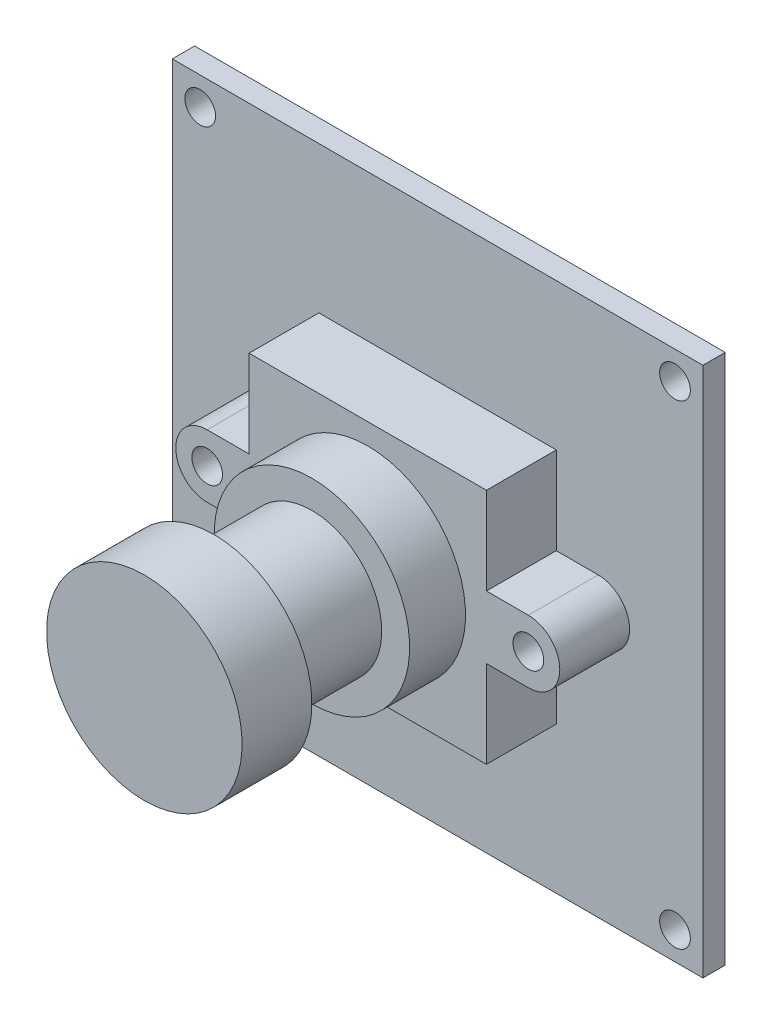
ISO-10303-21;
HEADER;
FILE_DESCRIPTION(('STEP AP214'),'2;1');
FILE_NAME('part.step','',(''),(''),'','','');
FILE_SCHEMA(('AUTOMOTIVE_DESIGN { 1 0 10303 214 1 1 1 1 }'));
ENDSEC;
DATA;
#1=APPLICATION_CONTEXT('core data for automotive mechanical design processes');
#2=APPLICATION_PROTOCOL_DEFINITION('international standard','automotive_design',2000,#1);
#3=PRODUCT_CONTEXT('',#1,'mechanical');
#4=PRODUCT('Part','Part','',(#3));
#5=PRODUCT_RELATED_PRODUCT_CATEGORY('part','',(#4));
#6=PRODUCT_DEFINITION_FORMATION('','',#4);
#7=PRODUCT_DEFINITION_CONTEXT('part definition',#1,'design');
#8=PRODUCT_DEFINITION('design','',#6,#7);
#9=PRODUCT_DEFINITION_SHAPE('','',#8);
#10=(LENGTH_UNIT() NAMED_UNIT(*) SI_UNIT(.MILLI.,.METRE.));
#11=(NAMED_UNIT(*) PLANE_ANGLE_UNIT() SI_UNIT($,.RADIAN.));
#12=(NAMED_UNIT(*) SI_UNIT($,.STERADIAN.) SOLID_ANGLE_UNIT());
#13=UNCERTAINTY_MEASURE_WITH_UNIT(LENGTH_MEASURE(1.E-05),#10,'distance_accuracy_value','');
#14=(GEOMETRIC_REPRESENTATION_CONTEXT(3) GLOBAL_UNCERTAINTY_ASSIGNED_CONTEXT((#13)) GLOBAL_UNIT_ASSIGNED_CONTEXT((#10,
#11,#12)) REPRESENTATION_CONTEXT('',''));
#15=CARTESIAN_POINT('',(0.,0.,0.));
#16=DIRECTION('',(0.,0.,1.));
#17=DIRECTION('',(1.,0.,0.));
#18=AXIS2_PLACEMENT_3D('',#15,#16,#17);
#19=CARTESIAN_POINT('',(0.,0.,0.));
#20=DIRECTION('',(0.,0.,-1.));
#21=DIRECTION('',(-1.,0.,0.));
#22=AXIS2_PLACEMENT_3D('',#19,#20,#21);
#23=PLANE('',#22);
#24=DIRECTION('',(0.,1.,0.));
#25=VECTOR('',#24,1.);
#26=CARTESIAN_POINT('',(-19.,-19.,0.));
#27=LINE('',#26,#25);
#28=CARTESIAN_POINT('',(-19.,-19.,0.));
#29=VERTEX_POINT('',#28);
#30=CARTESIAN_POINT('',(-19.,19.,0.));
#31=VERTEX_POINT('',#30);
#32=EDGE_CURVE('E518',#29,#31,#27,.T.);
#33=ORIENTED_EDGE('',*,*,#32,.F.);
#34=DIRECTION('',(1.,0.,0.));
#35=VECTOR('',#34,1.);
#36=CARTESIAN_POINT('',(-19.,-19.,0.));
#37=LINE('',#36,#35);
#38=CARTESIAN_POINT('',(19.,-19.,0.));
#39=VERTEX_POINT('',#38);
#40=EDGE_CURVE('E525',#29,#39,#37,.T.);
#41=ORIENTED_EDGE('',*,*,#40,.T.);
#42=DIRECTION('',(0.,1.,0.));
#43=VECTOR('',#42,1.);
#44=CARTESIAN_POINT('',(19.,-19.,0.));
#45=LINE('',#44,#43);
#46=CARTESIAN_POINT('',(19.,19.,0.));
#47=VERTEX_POINT('',#46);
#48=EDGE_CURVE('E539',#39,#47,#45,.T.);
#49=ORIENTED_EDGE('',*,*,#48,.T.);
#50=DIRECTION('',(1.,0.,0.));
#51=VECTOR('',#50,1.);
#52=CARTESIAN_POINT('',(-19.,19.,0.));
#53=LINE('',#52,#51);
#54=EDGE_CURVE('E536',#31,#47,#53,.T.);
#55=ORIENTED_EDGE('',*,*,#54,.F.);
#56=EDGE_LOOP('',(#33,#41,#49,#55));
#57=FACE_BOUND('',#56,.T.);
#58=CARTESIAN_POINT('',(-17.,17.,0.));
#59=DIRECTION('',(0.,0.,1.));
#60=DIRECTION('',(1.,0.,0.));
#61=AXIS2_PLACEMENT_3D('',#58,#59,#60);
#62=CIRCLE('',#61,1.1);
#63=CARTESIAN_POINT('',(-15.9,17.,0.));
#64=VERTEX_POINT('',#63);
#65=EDGE_CURVE('E512',#64,#64,#62,.T.);
#66=ORIENTED_EDGE('',*,*,#65,.F.);
#67=EDGE_LOOP('',(#66));
#68=FACE_BOUND('',#67,.T.);
#69=CARTESIAN_POINT('',(17.,17.,0.));
#70=DIRECTION('',(0.,0.,1.));
#71=DIRECTION('',(1.,0.,0.));
#72=AXIS2_PLACEMENT_3D('',#69,#70,#71);
#73=CIRCLE('',#72,1.1);
#74=CARTESIAN_POINT('',(18.1,17.,0.));
#75=VERTEX_POINT('',#74);
#76=EDGE_CURVE('E506',#75,#75,#73,.T.);
#77=ORIENTED_EDGE('',*,*,#76,.F.);
#78=EDGE_LOOP('',(#77));
#79=FACE_BOUND('',#78,.T.);
#80=CARTESIAN_POINT('',(17.0000000000004,-17.,0.));
#81=DIRECTION('',(0.,0.,1.));
#82=DIRECTION('',(1.,0.,0.));
#83=AXIS2_PLACEMENT_3D('',#80,#81,#82);
#84=CIRCLE('',#83,1.1);
#85=CARTESIAN_POINT('',(18.1000000000004,-17.,0.));
#86=VERTEX_POINT('',#85);
#87=EDGE_CURVE('E500',#86,#86,#84,.T.);
#88=ORIENTED_EDGE('',*,*,#87,.F.);
#89=EDGE_LOOP('',(#88));
#90=FACE_BOUND('',#89,.T.);
#91=CARTESIAN_POINT('',(-16.9999999999996,-17.,0.));
#92=DIRECTION('',(0.,0.,1.));
#93=DIRECTION('',(1.,0.,0.));
#94=AXIS2_PLACEMENT_3D('',#91,#92,#93);
#95=CIRCLE('',#94,1.1);
#96=CARTESIAN_POINT('',(-15.8999999999996,-17.,0.));
#97=VERTEX_POINT('',#96);
#98=EDGE_CURVE('E496',#97,#97,#95,.T.);
#99=ORIENTED_EDGE('',*,*,#98,.F.);
#100=EDGE_LOOP('',(#99));
#101=FACE_BOUND('',#100,.T.);
#102=CARTESIAN_POINT('',(11.5,0.,0.));
#103=DIRECTION('',(0.,0.,1.));
#104=DIRECTION('',(1.,0.,0.));
#105=AXIS2_PLACEMENT_3D('',#102,#103,#104);
#106=CIRCLE('',#105,2.25);
#107=CARTESIAN_POINT('',(11.5,-2.24999999999999,0.));
#108=VERTEX_POINT('',#107);
#109=CARTESIAN_POINT('',(11.5,2.25000000000001,0.));
#110=VERTEX_POINT('',#109);
#111=EDGE_CURVE('E469',#108,#110,#106,.T.);
#112=ORIENTED_EDGE('',*,*,#111,.F.);
#113=DIRECTION('',(1.,0.,0.));
#114=VECTOR('',#113,1.);
#115=CARTESIAN_POINT('',(-11.5,-2.25,0.));
#116=LINE('',#115,#114);
#117=CARTESIAN_POINT('',(8.5,-2.25,0.));
#118=VERTEX_POINT('',#117);
#119=EDGE_CURVE('E465',#118,#108,#116,.T.);
#120=ORIENTED_EDGE('',*,*,#119,.F.);
#121=DIRECTION('',(0.,1.,0.));
#122=VECTOR('',#121,1.);
#123=CARTESIAN_POINT('',(8.5,-8.5,0.));
#124=LINE('',#123,#122);
#125=CARTESIAN_POINT('',(8.5,-8.5,0.));
#126=VERTEX_POINT('',#125);
#127=EDGE_CURVE('E417',#126,#118,#124,.T.);
#128=ORIENTED_EDGE('',*,*,#127,.F.);
#129=DIRECTION('',(1.,0.,0.));
#130=VECTOR('',#129,1.);
#131=CARTESIAN_POINT('',(-8.50000000000001,-8.5,0.));
#132=LINE('',#131,#130);
#133=CARTESIAN_POINT('',(-8.50000000000001,-8.5,0.));
#134=VERTEX_POINT('',#133);
#135=EDGE_CURVE('E420',#134,#126,#132,.T.);
#136=ORIENTED_EDGE('',*,*,#135,.F.);
#137=DIRECTION('',(0.,1.,0.));
#138=VECTOR('',#137,1.);
#139=CARTESIAN_POINT('',(-8.50000000000001,-8.5,0.));
#140=LINE('',#139,#138);
#141=CARTESIAN_POINT('',(-8.50000000000001,-2.25,0.));
#142=VERTEX_POINT('',#141);
#143=EDGE_CURVE('E411',#134,#142,#140,.T.);
#144=ORIENTED_EDGE('',*,*,#143,.T.);
#145=CARTESIAN_POINT('',(-11.5,-2.25,0.));
#146=VERTEX_POINT('',#145);
#147=EDGE_CURVE('E466',#146,#142,#116,.T.);
#148=ORIENTED_EDGE('',*,*,#147,.F.);
#149=CARTESIAN_POINT('',(-11.5,0.,0.));
#150=DIRECTION('',(0.,0.,1.));
#151=DIRECTION('',(1.,0.,0.));
#152=AXIS2_PLACEMENT_3D('',#149,#150,#151);
#153=CIRCLE('',#152,2.25);
#154=CARTESIAN_POINT('',(-11.5,2.25,0.));
#155=VERTEX_POINT('',#154);
#156=EDGE_CURVE('E444',#155,#146,#153,.T.);
#157=ORIENTED_EDGE('',*,*,#156,.F.);
#158=DIRECTION('',(1.,0.,0.));
#159=VECTOR('',#158,1.);
#160=CARTESIAN_POINT('',(-11.5,2.25,0.));
#161=LINE('',#160,#159);
#162=CARTESIAN_POINT('',(-8.50000000000001,2.25,0.));
#163=VERTEX_POINT('',#162);
#164=EDGE_CURVE('E451',#155,#163,#161,.T.);
#165=ORIENTED_EDGE('',*,*,#164,.T.);
#166=CARTESIAN_POINT('',(-8.50000000000001,8.5,0.));
#167=VERTEX_POINT('',#166);
#168=EDGE_CURVE('E414',#163,#167,#140,.T.);
#169=ORIENTED_EDGE('',*,*,#168,.T.);
#170=DIRECTION('',(1.,0.,0.));
#171=VECTOR('',#170,1.);
#172=CARTESIAN_POINT('',(-8.50000000000001,8.5,0.));
#173=LINE('',#172,#171);
#174=CARTESIAN_POINT('',(8.5,8.5,0.));
#175=VERTEX_POINT('',#174);
#176=EDGE_CURVE('E413',#167,#175,#173,.T.);
#177=ORIENTED_EDGE('',*,*,#176,.T.);
#178=CARTESIAN_POINT('',(8.5,2.25000000000001,0.));
#179=VERTEX_POINT('',#178);
#180=EDGE_CURVE('E416',#179,#175,#124,.T.);
#181=ORIENTED_EDGE('',*,*,#180,.F.);
#182=EDGE_CURVE('E472',#179,#110,#161,.T.);
#183=ORIENTED_EDGE('',*,*,#182,.T.);
#184=EDGE_LOOP('',(#112,#120,#128,#136,#144,#148,#157,#165,#169,#177,#181,#183));
#185=FACE_BOUND('',#184,.T.);
#186=ADVANCED_FACE('F163',(#57,#68,#79,#90,#101,#185),#23,.F.);
#187=CARTESIAN_POINT('',(-19.,-19.,-1.6));
#188=DIRECTION('',(1.,0.,0.));
#189=DIRECTION('',(0.,0.,-1.));
#190=AXIS2_PLACEMENT_3D('',#187,#188,#189);
#191=PLANE('',#190);
#192=ORIENTED_EDGE('',*,*,#32,.T.);
#193=DIRECTION('',(0.,0.,1.));
#194=VECTOR('',#193,1.);
#195=CARTESIAN_POINT('',(-19.,19.,-1.6));
#196=LINE('',#195,#194);
#197=CARTESIAN_POINT('',(-19.,19.,-1.6));
#198=VERTEX_POINT('',#197);
#199=EDGE_CURVE('E549',#198,#31,#196,.T.);
#200=ORIENTED_EDGE('',*,*,#199,.F.);
#201=DIRECTION('',(0.,1.,0.));
#202=VECTOR('',#201,1.);
#203=CARTESIAN_POINT('',(-19.,-19.,-1.6));
#204=LINE('',#203,#202);
#205=CARTESIAN_POINT('',(-19.,-19.,-1.6));
#206=VERTEX_POINT('',#205);
#207=EDGE_CURVE('E521',#206,#198,#204,.T.);
#208=ORIENTED_EDGE('',*,*,#207,.F.);
#209=DIRECTION('',(0.,0.,1.));
#210=VECTOR('',#209,1.);
#211=CARTESIAN_POINT('',(-19.,-19.,-1.6));
#212=LINE('',#211,#210);
#213=EDGE_CURVE('E533',#206,#29,#212,.T.);
#214=ORIENTED_EDGE('',*,*,#213,.T.);
#215=EDGE_LOOP('',(#192,#200,#208,#214));
#216=FACE_BOUND('',#215,.T.);
#217=ADVANCED_FACE('F165',(#216),#191,.F.);
#218=CARTESIAN_POINT('',(-19.,19.,-1.6));
#219=DIRECTION('',(0.,-1.,0.));
#220=DIRECTION('',(0.,0.,-1.));
#221=AXIS2_PLACEMENT_3D('',#218,#219,#220);
#222=PLANE('',#221);
#223=ORIENTED_EDGE('',*,*,#54,.T.);
#224=DIRECTION('',(0.,0.,1.));
#225=VECTOR('',#224,1.);
#226=CARTESIAN_POINT('',(19.,19.,-1.6));
#227=LINE('',#226,#225);
#228=CARTESIAN_POINT('',(19.,19.,-1.6));
#229=VERTEX_POINT('',#228);
#230=EDGE_CURVE('E547',#229,#47,#227,.T.);
#231=ORIENTED_EDGE('',*,*,#230,.F.);
#232=DIRECTION('',(1.,0.,0.));
#233=VECTOR('',#232,1.);
#234=CARTESIAN_POINT('',(-19.,19.,-1.6));
#235=LINE('',#234,#233);
#236=EDGE_CURVE('E524',#198,#229,#235,.T.);
#237=ORIENTED_EDGE('',*,*,#236,.F.);
#238=ORIENTED_EDGE('',*,*,#199,.T.);
#239=EDGE_LOOP('',(#223,#231,#237,#238));
#240=FACE_BOUND('',#239,.T.);
#241=ADVANCED_FACE('F585',(#240),#222,.F.);
#242=CARTESIAN_POINT('',(19.,-19.,-1.6));
#243=DIRECTION('',(1.,0.,0.));
#244=DIRECTION('',(0.,0.,-1.));
#245=AXIS2_PLACEMENT_3D('',#242,#243,#244);
#246=PLANE('',#245);
#247=ORIENTED_EDGE('',*,*,#48,.F.);
#248=DIRECTION('',(0.,0.,1.));
#249=VECTOR('',#248,1.);
#250=CARTESIAN_POINT('',(19.,-19.,-1.6));
#251=LINE('',#250,#249);
#252=CARTESIAN_POINT('',(19.,-19.,-1.6));
#253=VERTEX_POINT('',#252);
#254=EDGE_CURVE('E545',#253,#39,#251,.T.);
#255=ORIENTED_EDGE('',*,*,#254,.F.);
#256=DIRECTION('',(0.,1.,0.));
#257=VECTOR('',#256,1.);
#258=CARTESIAN_POINT('',(19.,-19.,-1.6));
#259=LINE('',#258,#257);
#260=EDGE_CURVE('E527',#253,#229,#259,.T.);
#261=ORIENTED_EDGE('',*,*,#260,.T.);
#262=ORIENTED_EDGE('',*,*,#230,.T.);
#263=EDGE_LOOP('',(#247,#255,#261,#262));
#264=FACE_BOUND('',#263,.T.);
#265=ADVANCED_FACE('F661',(#264),#246,.T.);
#266=CARTESIAN_POINT('',(-19.,-19.,-1.6));
#267=DIRECTION('',(0.,-1.,0.));
#268=DIRECTION('',(0.,0.,-1.));
#269=AXIS2_PLACEMENT_3D('',#266,#267,#268);
#270=PLANE('',#269);
#271=ORIENTED_EDGE('',*,*,#40,.F.);
#272=ORIENTED_EDGE('',*,*,#213,.F.);
#273=DIRECTION('',(1.,0.,0.));
#274=VECTOR('',#273,1.);
#275=CARTESIAN_POINT('',(-19.,-19.,-1.6));
#276=LINE('',#275,#274);
#277=EDGE_CURVE('E530',#206,#253,#276,.T.);
#278=ORIENTED_EDGE('',*,*,#277,.T.);
#279=ORIENTED_EDGE('',*,*,#254,.T.);
#280=EDGE_LOOP('',(#271,#272,#278,#279));
#281=FACE_BOUND('',#280,.T.);
#282=ADVANCED_FACE('F656',(#281),#270,.T.);
#283=CARTESIAN_POINT('',(0.,0.,-1.6));
#284=DIRECTION('',(0.,0.,-1.));
#285=DIRECTION('',(-1.,0.,0.));
#286=AXIS2_PLACEMENT_3D('',#283,#284,#285);
#287=PLANE('',#286);
#288=DIRECTION('',(-1.,0.,0.));
#289=VECTOR('',#288,1.);
#290=CARTESIAN_POINT('',(0.,-16.7999999999893,-1.6));
#291=LINE('',#290,#289);
#292=CARTESIAN_POINT('',(12.0000000000005,-16.7999999999893,-1.6));
#293=VERTEX_POINT('',#292);
#294=CARTESIAN_POINT('',(5.99999999997181,-16.7999999999893,-1.6));
#295=VERTEX_POINT('',#294);
#296=EDGE_CURVE('E12',#293,#295,#291,.T.);
#297=ORIENTED_EDGE('',*,*,#296,.F.);
#298=DIRECTION('',(0.,-1.,0.));
#299=VECTOR('',#298,1.);
#300=CARTESIAN_POINT('',(12.0000000000005,0.,-1.6));
#301=LINE('',#300,#299);
#302=CARTESIAN_POINT('',(12.0000000000005,-13.8000000000053,-1.6));
#303=VERTEX_POINT('',#302);
#304=EDGE_CURVE('E326',#303,#293,#301,.T.);
#305=ORIENTED_EDGE('',*,*,#304,.F.);
#306=DIRECTION('',(1.,0.,0.));
#307=VECTOR('',#306,1.);
#308=CARTESIAN_POINT('',(0.,-13.8000000000053,-1.6));
#309=LINE('',#308,#307);
#310=CARTESIAN_POINT('',(5.99999999997181,-13.8000000000053,-1.6));
#311=VERTEX_POINT('',#310);
#312=EDGE_CURVE('E181',#311,#303,#309,.T.);
#313=ORIENTED_EDGE('',*,*,#312,.F.);
#314=DIRECTION('',(0.,1.,0.));
#315=VECTOR('',#314,1.);
#316=CARTESIAN_POINT('',(5.99999999997181,0.,-1.6));
#317=LINE('',#316,#315);
#318=EDGE_CURVE('E171',#295,#311,#317,.T.);
#319=ORIENTED_EDGE('',*,*,#318,.F.);
#320=EDGE_LOOP('',(#297,#305,#313,#319));
#321=FACE_BOUND('',#320,.T.);
#322=DIRECTION('',(-1.,0.,0.));
#323=VECTOR('',#322,1.);
#324=CARTESIAN_POINT('',(0.,-16.8000000000056,-1.6));
#325=LINE('',#324,#323);
#326=CARTESIAN_POINT('',(2.50000000002518,-16.7999999999893,-1.6));
#327=VERTEX_POINT('',#326);
#328=CARTESIAN_POINT('',(-6.50000000001876,-16.7999999999893,-1.6));
#329=VERTEX_POINT('',#328);
#330=EDGE_CURVE('E561',#327,#329,#325,.T.);
#331=ORIENTED_EDGE('',*,*,#330,.F.);
#332=DIRECTION('',(0.,-1.,0.));
#333=VECTOR('',#332,1.);
#334=CARTESIAN_POINT('',(2.50000000002518,0.,-1.6));
#335=LINE('',#334,#333);
#336=CARTESIAN_POINT('',(2.50000000002518,-13.8000000000275,-1.6));
#337=VERTEX_POINT('',#336);
#338=EDGE_CURVE('E552',#337,#327,#335,.T.);
#339=ORIENTED_EDGE('',*,*,#338,.F.);
#340=DIRECTION('',(1.,0.,0.));
#341=VECTOR('',#340,1.);
#342=CARTESIAN_POINT('',(0.,-13.8000000000275,-1.6));
#343=LINE('',#342,#341);
#344=CARTESIAN_POINT('',(-6.50000000001876,-13.8000000000275,-1.6));
#345=VERTEX_POINT('',#344);
#346=EDGE_CURVE('E555',#345,#337,#343,.T.);
#347=ORIENTED_EDGE('',*,*,#346,.F.);
#348=DIRECTION('',(0.,1.,0.));
#349=VECTOR('',#348,1.);
#350=CARTESIAN_POINT('',(-6.50000000001875,0.,-1.6));
#351=LINE('',#350,#349);
#352=EDGE_CURVE('E558',#329,#345,#351,.T.);
#353=ORIENTED_EDGE('',*,*,#352,.F.);
#354=EDGE_LOOP('',(#331,#339,#347,#353));
#355=FACE_BOUND('',#354,.T.);
#356=CARTESIAN_POINT('',(-16.9999999999996,-17.,-1.6));
#357=DIRECTION('',(0.,0.,1.));
#358=DIRECTION('',(1.,0.,0.));
#359=AXIS2_PLACEMENT_3D('',#356,#357,#358);
#360=CIRCLE('',#359,1.1);
#361=CARTESIAN_POINT('',(-15.8999999999996,-17.,-1.6));
#362=VERTEX_POINT('',#361);
#363=EDGE_CURVE('E497',#362,#362,#360,.T.);
#364=ORIENTED_EDGE('',*,*,#363,.T.);
#365=EDGE_LOOP('',(#364));
#366=FACE_BOUND('',#365,.T.);
#367=CARTESIAN_POINT('',(17.0000000000004,-17.,-1.6));
#368=DIRECTION('',(0.,0.,1.));
#369=DIRECTION('',(1.,0.,0.));
#370=AXIS2_PLACEMENT_3D('',#367,#368,#369);
#371=CIRCLE('',#370,1.1);
#372=CARTESIAN_POINT('',(18.1000000000004,-17.,-1.6));
#373=VERTEX_POINT('',#372);
#374=EDGE_CURVE('E503',#373,#373,#371,.T.);
#375=ORIENTED_EDGE('',*,*,#374,.T.);
#376=EDGE_LOOP('',(#375));
#377=FACE_BOUND('',#376,.T.);
#378=CARTESIAN_POINT('',(17.,17.,-1.6));
#379=DIRECTION('',(0.,0.,1.));
#380=DIRECTION('',(1.,0.,0.));
#381=AXIS2_PLACEMENT_3D('',#378,#379,#380);
#382=CIRCLE('',#381,1.1);
#383=CARTESIAN_POINT('',(18.1,17.,-1.6));
#384=VERTEX_POINT('',#383);
#385=EDGE_CURVE('E509',#384,#384,#382,.T.);
#386=ORIENTED_EDGE('',*,*,#385,.T.);
#387=EDGE_LOOP('',(#386));
#388=FACE_BOUND('',#387,.T.);
#389=CARTESIAN_POINT('',(-17.,17.,-1.6));
#390=DIRECTION('',(0.,0.,1.));
#391=DIRECTION('',(1.,0.,0.));
#392=AXIS2_PLACEMENT_3D('',#389,#390,#391);
#393=CIRCLE('',#392,1.1);
#394=CARTESIAN_POINT('',(-15.9,17.,-1.6));
#395=VERTEX_POINT('',#394);
#396=EDGE_CURVE('E515',#395,#395,#393,.T.);
#397=ORIENTED_EDGE('',*,*,#396,.T.);
#398=EDGE_LOOP('',(#397));
#399=FACE_BOUND('',#398,.T.);
#400=ORIENTED_EDGE('',*,*,#207,.T.);
#401=ORIENTED_EDGE('',*,*,#236,.T.);
#402=ORIENTED_EDGE('',*,*,#260,.F.);
#403=ORIENTED_EDGE('',*,*,#277,.F.);
#404=EDGE_LOOP('',(#400,#401,#402,#403));
#405=FACE_BOUND('',#404,.T.);
#406=ADVANCED_FACE('F653',(#321,#355,#366,#377,#388,#399,#405),#287,.T.);
#407=CARTESIAN_POINT('',(-17.,17.,-1.6));
#408=DIRECTION('',(0.,0.,1.));
#409=DIRECTION('',(1.,0.,0.));
#410=AXIS2_PLACEMENT_3D('',#407,#408,#409);
#411=CYLINDRICAL_SURFACE('',#410,1.1);
#412=ORIENTED_EDGE('',*,*,#396,.F.);
#413=EDGE_LOOP('',(#412));
#414=FACE_BOUND('',#413,.T.);
#415=ORIENTED_EDGE('',*,*,#65,.T.);
#416=EDGE_LOOP('',(#415));
#417=FACE_BOUND('',#416,.T.);
#418=ADVANCED_FACE('F650',(#414,#417),#411,.F.);
#419=CARTESIAN_POINT('',(17.,17.,-1.6));
#420=DIRECTION('',(0.,0.,1.));
#421=DIRECTION('',(1.,0.,0.));
#422=AXIS2_PLACEMENT_3D('',#419,#420,#421);
#423=CYLINDRICAL_SURFACE('',#422,1.1);
#424=ORIENTED_EDGE('',*,*,#385,.F.);
#425=EDGE_LOOP('',(#424));
#426=FACE_BOUND('',#425,.T.);
#427=ORIENTED_EDGE('',*,*,#76,.T.);
#428=EDGE_LOOP('',(#427));
#429=FACE_BOUND('',#428,.T.);
#430=ADVANCED_FACE('F646',(#426,#429),#423,.F.);
#431=CARTESIAN_POINT('',(17.0000000000004,-17.,-1.6));
#432=DIRECTION('',(0.,0.,1.));
#433=DIRECTION('',(1.,0.,0.));
#434=AXIS2_PLACEMENT_3D('',#431,#432,#433);
#435=CYLINDRICAL_SURFACE('',#434,1.1);
#436=ORIENTED_EDGE('',*,*,#374,.F.);
#437=EDGE_LOOP('',(#436));
#438=FACE_BOUND('',#437,.T.);
#439=ORIENTED_EDGE('',*,*,#87,.T.);
#440=EDGE_LOOP('',(#439));
#441=FACE_BOUND('',#440,.T.);
#442=ADVANCED_FACE('F642',(#438,#441),#435,.F.);
#443=CARTESIAN_POINT('',(-16.9999999999996,-17.,-1.6));
#444=DIRECTION('',(0.,0.,1.));
#445=DIRECTION('',(1.,0.,0.));
#446=AXIS2_PLACEMENT_3D('',#443,#444,#445);
#447=CYLINDRICAL_SURFACE('',#446,1.1);
#448=ORIENTED_EDGE('',*,*,#363,.F.);
#449=EDGE_LOOP('',(#448));
#450=FACE_BOUND('',#449,.T.);
#451=ORIENTED_EDGE('',*,*,#98,.T.);
#452=EDGE_LOOP('',(#451));
#453=FACE_BOUND('',#452,.T.);
#454=ADVANCED_FACE('F638',(#450,#453),#447,.F.);
#455=CARTESIAN_POINT('',(8.5,-8.5,5.));
#456=DIRECTION('',(-1.,0.,0.));
#457=DIRECTION('',(0.,0.,1.));
#458=AXIS2_PLACEMENT_3D('',#455,#456,#457);
#459=PLANE('',#458);
#460=DIRECTION('',(0.,1.,0.));
#461=VECTOR('',#460,1.);
#462=CARTESIAN_POINT('',(8.5,-8.5,5.));
#463=LINE('',#462,#461);
#464=CARTESIAN_POINT('',(8.5,2.25000000000001,5.));
#465=VERTEX_POINT('',#464);
#466=CARTESIAN_POINT('',(8.5,8.5,5.));
#467=VERTEX_POINT('',#466);
#468=EDGE_CURVE('E404',#465,#467,#463,.T.);
#469=ORIENTED_EDGE('',*,*,#468,.F.);
#470=DIRECTION('',(0.,0.,-1.));
#471=VECTOR('',#470,1.);
#472=CARTESIAN_POINT('',(8.5,2.25000000000001,5.));
#473=LINE('',#472,#471);
#474=EDGE_CURVE('E426',#465,#179,#473,.T.);
#475=ORIENTED_EDGE('',*,*,#474,.T.);
#476=ORIENTED_EDGE('',*,*,#180,.T.);
#477=DIRECTION('',(0.,0.,-1.));
#478=VECTOR('',#477,1.);
#479=CARTESIAN_POINT('',(8.5,8.5,5.));
#480=LINE('',#479,#478);
#481=EDGE_CURVE('E430',#467,#175,#480,.T.);
#482=ORIENTED_EDGE('',*,*,#481,.F.);
#483=EDGE_LOOP('',(#469,#475,#476,#482));
#484=FACE_BOUND('',#483,.T.);
#485=ADVANCED_FACE('F641',(#484),#459,.F.);
#486=CARTESIAN_POINT('',(-8.50000000000001,8.5,5.));
#487=DIRECTION('',(0.,1.,0.));
#488=DIRECTION('',(0.,0.,1.));
#489=AXIS2_PLACEMENT_3D('',#486,#487,#488);
#490=PLANE('',#489);
#491=ORIENTED_EDGE('',*,*,#176,.F.);
#492=DIRECTION('',(0.,0.,-1.));
#493=VECTOR('',#492,1.);
#494=CARTESIAN_POINT('',(-8.50000000000001,8.5,5.));
#495=LINE('',#494,#493);
#496=CARTESIAN_POINT('',(-8.50000000000001,8.5,5.));
#497=VERTEX_POINT('',#496);
#498=EDGE_CURVE('E410',#497,#167,#495,.T.);
#499=ORIENTED_EDGE('',*,*,#498,.F.);
#500=DIRECTION('',(1.,0.,0.));
#501=VECTOR('',#500,1.);
#502=CARTESIAN_POINT('',(-8.50000000000001,8.5,5.));
#503=LINE('',#502,#501);
#504=EDGE_CURVE('E400',#497,#467,#503,.T.);
#505=ORIENTED_EDGE('',*,*,#504,.T.);
#506=ORIENTED_EDGE('',*,*,#481,.T.);
#507=EDGE_LOOP('',(#491,#499,#505,#506));
#508=FACE_BOUND('',#507,.T.);
#509=ADVANCED_FACE('F765',(#508),#490,.T.);
#510=CARTESIAN_POINT('',(-8.50000000000001,-8.5,5.));
#511=DIRECTION('',(-1.,0.,0.));
#512=DIRECTION('',(0.,0.,1.));
#513=AXIS2_PLACEMENT_3D('',#510,#511,#512);
#514=PLANE('',#513);
#515=DIRECTION('',(0.,0.,-1.));
#516=VECTOR('',#515,1.);
#517=CARTESIAN_POINT('',(-8.50000000000001,2.25,5.));
#518=LINE('',#517,#516);
#519=CARTESIAN_POINT('',(-8.50000000000001,2.25000000000001,5.));
#520=VERTEX_POINT('',#519);
#521=EDGE_CURVE('E488',#520,#163,#518,.T.);
#522=ORIENTED_EDGE('',*,*,#521,.F.);
#523=DIRECTION('',(0.,1.,0.));
#524=VECTOR('',#523,1.);
#525=CARTESIAN_POINT('',(-8.50000000000001,-8.5,5.));
#526=LINE('',#525,#524);
#527=EDGE_CURVE('E401',#520,#497,#526,.T.);
#528=ORIENTED_EDGE('',*,*,#527,.T.);
#529=ORIENTED_EDGE('',*,*,#498,.T.);
#530=ORIENTED_EDGE('',*,*,#168,.F.);
#531=EDGE_LOOP('',(#522,#528,#529,#530));
#532=FACE_BOUND('',#531,.T.);
#533=ADVANCED_FACE('F623',(#532),#514,.T.);
#534=CARTESIAN_POINT('',(0.,0.,5.));
#535=DIRECTION('',(0.,0.,-1.));
#536=DIRECTION('',(-1.,0.,0.));
#537=AXIS2_PLACEMENT_3D('',#534,#535,#536);
#538=PLANE('',#537);
#539=CARTESIAN_POINT('',(0.,0.,5.));
#540=DIRECTION('',(0.,0.,-1.));
#541=DIRECTION('',(0.,1.,0.));
#542=AXIS2_PLACEMENT_3D('',#539,#540,#541);
#543=CIRCLE('',#542,6.99999999999999);
#544=CARTESIAN_POINT('',(0.,7.,5.));
#545=VERTEX_POINT('',#544);
#546=EDGE_CURVE('E393',#545,#545,#543,.T.);
#547=ORIENTED_EDGE('',*,*,#546,.T.);
#548=EDGE_LOOP('',(#547));
#549=FACE_BOUND('',#548,.T.);
#550=ORIENTED_EDGE('',*,*,#527,.F.);
#551=DIRECTION('',(1.,0.,0.));
#552=VECTOR('',#551,1.);
#553=CARTESIAN_POINT('',(-11.5,2.25,5.));
#554=LINE('',#553,#552);
#555=CARTESIAN_POINT('',(-11.5,2.25,5.));
#556=VERTEX_POINT('',#555);
#557=EDGE_CURVE('E459',#556,#520,#554,.T.);
#558=ORIENTED_EDGE('',*,*,#557,.F.);
#559=CARTESIAN_POINT('',(-11.5,0.,5.));
#560=DIRECTION('',(0.,0.,1.));
#561=DIRECTION('',(1.,0.,0.));
#562=AXIS2_PLACEMENT_3D('',#559,#560,#561);
#563=CIRCLE('',#562,2.25);
#564=CARTESIAN_POINT('',(-11.5,-2.25,5.));
#565=VERTEX_POINT('',#564);
#566=EDGE_CURVE('E447',#556,#565,#563,.T.);
#567=ORIENTED_EDGE('',*,*,#566,.T.);
#568=DIRECTION('',(1.,0.,0.));
#569=VECTOR('',#568,1.);
#570=CARTESIAN_POINT('',(-11.5,-2.25,5.));
#571=LINE('',#570,#569);
#572=CARTESIAN_POINT('',(-8.50000000000001,-2.25,5.));
#573=VERTEX_POINT('',#572);
#574=EDGE_CURVE('E452',#565,#573,#571,.T.);
#575=ORIENTED_EDGE('',*,*,#574,.T.);
#576=CARTESIAN_POINT('',(-8.50000000000001,-8.5,5.));
#577=VERTEX_POINT('',#576);
#578=EDGE_CURVE('E397',#577,#573,#526,.T.);
#579=ORIENTED_EDGE('',*,*,#578,.F.);
#580=DIRECTION('',(1.,0.,0.));
#581=VECTOR('',#580,1.);
#582=CARTESIAN_POINT('',(-8.50000000000001,-8.5,5.));
#583=LINE('',#582,#581);
#584=CARTESIAN_POINT('',(8.5,-8.5,5.));
#585=VERTEX_POINT('',#584);
#586=EDGE_CURVE('E408',#577,#585,#583,.T.);
#587=ORIENTED_EDGE('',*,*,#586,.T.);
#588=CARTESIAN_POINT('',(8.5,-2.25,5.));
#589=VERTEX_POINT('',#588);
#590=EDGE_CURVE('E405',#585,#589,#463,.T.);
#591=ORIENTED_EDGE('',*,*,#590,.T.);
#592=CARTESIAN_POINT('',(11.5,-2.24999999999999,5.));
#593=VERTEX_POINT('',#592);
#594=EDGE_CURVE('E450',#589,#593,#571,.T.);
#595=ORIENTED_EDGE('',*,*,#594,.T.);
#596=CARTESIAN_POINT('',(11.5,0.,5.));
#597=DIRECTION('',(0.,0.,1.));
#598=DIRECTION('',(1.,0.,0.));
#599=AXIS2_PLACEMENT_3D('',#596,#597,#598);
#600=CIRCLE('',#599,2.25);
#601=CARTESIAN_POINT('',(11.5,2.25000000000001,5.));
#602=VERTEX_POINT('',#601);
#603=EDGE_CURVE('E455',#593,#602,#600,.T.);
#604=ORIENTED_EDGE('',*,*,#603,.T.);
#605=EDGE_CURVE('E458',#465,#602,#554,.T.);
#606=ORIENTED_EDGE('',*,*,#605,.F.);
#607=ORIENTED_EDGE('',*,*,#468,.T.);
#608=ORIENTED_EDGE('',*,*,#504,.F.);
#609=EDGE_LOOP('',(#550,#558,#567,#575,#579,#587,#591,#595,#604,#606,#607,#608));
#610=FACE_BOUND('',#609,.T.);
#611=CARTESIAN_POINT('',(11.5,0.,5.));
#612=DIRECTION('',(0.,0.,1.));
#613=DIRECTION('',(1.,0.,0.));
#614=AXIS2_PLACEMENT_3D('',#611,#612,#613);
#615=CIRCLE('',#614,1.1);
#616=CARTESIAN_POINT('',(12.6,0.,5.));
#617=VERTEX_POINT('',#616);
#618=EDGE_CURVE('E441',#617,#617,#615,.T.);
#619=ORIENTED_EDGE('',*,*,#618,.F.);
#620=EDGE_LOOP('',(#619));
#621=FACE_BOUND('',#620,.T.);
#622=CARTESIAN_POINT('',(-11.5,0.,5.));
#623=DIRECTION('',(0.,0.,1.));
#624=DIRECTION('',(1.,0.,0.));
#625=AXIS2_PLACEMENT_3D('',#622,#623,#624);
#626=CIRCLE('',#625,1.1);
#627=CARTESIAN_POINT('',(-10.4,0.,5.));
#628=VERTEX_POINT('',#627);
#629=EDGE_CURVE('E435',#628,#628,#626,.T.);
#630=ORIENTED_EDGE('',*,*,#629,.F.);
#631=EDGE_LOOP('',(#630));
#632=FACE_BOUND('',#631,.T.);
#633=ADVANCED_FACE('F789',(#549,#610,#621,#632),#538,.F.);
#634=CARTESIAN_POINT('',(-8.50000000000001,-8.5,5.));
#635=DIRECTION('',(0.,1.,0.));
#636=DIRECTION('',(0.,0.,1.));
#637=AXIS2_PLACEMENT_3D('',#634,#635,#636);
#638=PLANE('',#637);
#639=ORIENTED_EDGE('',*,*,#135,.T.);
#640=DIRECTION('',(0.,0.,-1.));
#641=VECTOR('',#640,1.);
#642=CARTESIAN_POINT('',(8.5,-8.5,5.));
#643=LINE('',#642,#641);
#644=EDGE_CURVE('E427',#585,#126,#643,.T.);
#645=ORIENTED_EDGE('',*,*,#644,.F.);
#646=ORIENTED_EDGE('',*,*,#586,.F.);
#647=DIRECTION('',(0.,0.,-1.));
#648=VECTOR('',#647,1.);
#649=CARTESIAN_POINT('',(-8.50000000000001,-8.5,5.));
#650=LINE('',#649,#648);
#651=EDGE_CURVE('E423',#577,#134,#650,.T.);
#652=ORIENTED_EDGE('',*,*,#651,.T.);
#653=EDGE_LOOP('',(#639,#645,#646,#652));
#654=FACE_BOUND('',#653,.T.);
#655=ADVANCED_FACE('F797',(#654),#638,.F.);
#656=DIRECTION('',(0.,0.,-1.));
#657=VECTOR('',#656,1.);
#658=CARTESIAN_POINT('',(8.5,-2.24999999999999,5.));
#659=LINE('',#658,#657);
#660=EDGE_CURVE('E487',#589,#118,#659,.T.);
#661=ORIENTED_EDGE('',*,*,#660,.F.);
#662=ORIENTED_EDGE('',*,*,#590,.F.);
#663=ORIENTED_EDGE('',*,*,#644,.T.);
#664=ORIENTED_EDGE('',*,*,#127,.T.);
#665=EDGE_LOOP('',(#661,#662,#663,#664));
#666=FACE_BOUND('',#665,.T.);
#667=ADVANCED_FACE('F620',(#666),#459,.F.);
#668=ORIENTED_EDGE('',*,*,#578,.T.);
#669=DIRECTION('',(0.,0.,-1.));
#670=VECTOR('',#669,1.);
#671=CARTESIAN_POINT('',(-8.50000000000001,-2.25,5.));
#672=LINE('',#671,#670);
#673=EDGE_CURVE('E491',#573,#142,#672,.T.);
#674=ORIENTED_EDGE('',*,*,#673,.T.);
#675=ORIENTED_EDGE('',*,*,#143,.F.);
#676=ORIENTED_EDGE('',*,*,#651,.F.);
#677=EDGE_LOOP('',(#668,#674,#675,#676));
#678=FACE_BOUND('',#677,.T.);
#679=ADVANCED_FACE('F610',(#678),#514,.T.);
#680=CARTESIAN_POINT('',(11.5,0.,5.));
#681=DIRECTION('',(0.,0.,-1.));
#682=DIRECTION('',(-1.,0.,0.));
#683=AXIS2_PLACEMENT_3D('',#680,#681,#682);
#684=CYLINDRICAL_SURFACE('',#683,1.1);
#685=ORIENTED_EDGE('',*,*,#618,.T.);
#686=EDGE_LOOP('',(#685));
#687=FACE_BOUND('',#686,.T.);
#688=CARTESIAN_POINT('',(11.5,0.,0.));
#689=DIRECTION('',(0.,0.,1.));
#690=DIRECTION('',(1.,0.,0.));
#691=AXIS2_PLACEMENT_3D('',#688,#689,#690);
#692=CIRCLE('',#691,1.1);
#693=CARTESIAN_POINT('',(12.6,0.,0.));
#694=VERTEX_POINT('',#693);
#695=EDGE_CURVE('E438',#694,#694,#692,.T.);
#696=ORIENTED_EDGE('',*,*,#695,.F.);
#697=EDGE_LOOP('',(#696));
#698=FACE_BOUND('',#697,.T.);
#699=ADVANCED_FACE('F607',(#687,#698),#684,.F.);
#700=CARTESIAN_POINT('',(11.5,0.,5.));
#701=DIRECTION('',(0.,0.,-1.));
#702=DIRECTION('',(-1.,0.,0.));
#703=AXIS2_PLACEMENT_3D('',#700,#701,#702);
#704=CYLINDRICAL_SURFACE('',#703,2.25);
#705=ORIENTED_EDGE('',*,*,#111,.T.);
#706=DIRECTION('',(0.,0.,-1.));
#707=VECTOR('',#706,1.);
#708=CARTESIAN_POINT('',(11.5,2.25000000000001,5.));
#709=LINE('',#708,#707);
#710=EDGE_CURVE('E476',#602,#110,#709,.T.);
#711=ORIENTED_EDGE('',*,*,#710,.F.);
#712=ORIENTED_EDGE('',*,*,#603,.F.);
#713=DIRECTION('',(0.,0.,-1.));
#714=VECTOR('',#713,1.);
#715=CARTESIAN_POINT('',(11.5,-2.24999999999999,5.));
#716=LINE('',#715,#714);
#717=EDGE_CURVE('E479',#593,#108,#716,.T.);
#718=ORIENTED_EDGE('',*,*,#717,.T.);
#719=EDGE_LOOP('',(#705,#711,#712,#718));
#720=FACE_BOUND('',#719,.T.);
#721=ADVANCED_FACE('F609',(#720),#704,.T.);
#722=CARTESIAN_POINT('',(-11.5,2.25,5.));
#723=DIRECTION('',(0.,1.,0.));
#724=DIRECTION('',(-1.,0.,0.));
#725=AXIS2_PLACEMENT_3D('',#722,#723,#724);
#726=PLANE('',#725);
#727=ORIENTED_EDGE('',*,*,#474,.F.);
#728=ORIENTED_EDGE('',*,*,#605,.T.);
#729=ORIENTED_EDGE('',*,*,#710,.T.);
#730=ORIENTED_EDGE('',*,*,#182,.F.);
#731=EDGE_LOOP('',(#727,#728,#729,#730));
#732=FACE_BOUND('',#731,.T.);
#733=ADVANCED_FACE('F617',(#732),#726,.T.);
#734=CARTESIAN_POINT('',(-11.5,-2.25,5.));
#735=DIRECTION('',(0.,1.,0.));
#736=DIRECTION('',(-1.,0.,0.));
#737=AXIS2_PLACEMENT_3D('',#734,#735,#736);
#738=PLANE('',#737);
#739=ORIENTED_EDGE('',*,*,#594,.F.);
#740=ORIENTED_EDGE('',*,*,#660,.T.);
#741=ORIENTED_EDGE('',*,*,#119,.T.);
#742=ORIENTED_EDGE('',*,*,#717,.F.);
#743=EDGE_LOOP('',(#739,#740,#741,#742));
#744=FACE_BOUND('',#743,.T.);
#745=ADVANCED_FACE('F634',(#744),#738,.F.);
#746=CARTESIAN_POINT('',(-11.5,0.,5.));
#747=DIRECTION('',(0.,0.,-1.));
#748=DIRECTION('',(-1.,0.,0.));
#749=AXIS2_PLACEMENT_3D('',#746,#747,#748);
#750=CYLINDRICAL_SURFACE('',#749,1.1);
#751=ORIENTED_EDGE('',*,*,#629,.T.);
#752=EDGE_LOOP('',(#751));
#753=FACE_BOUND('',#752,.T.);
#754=CARTESIAN_POINT('',(-11.5,0.,0.));
#755=DIRECTION('',(0.,0.,1.));
#756=DIRECTION('',(1.,0.,0.));
#757=AXIS2_PLACEMENT_3D('',#754,#755,#756);
#758=CIRCLE('',#757,1.1);
#759=CARTESIAN_POINT('',(-10.4,0.,0.));
#760=VERTEX_POINT('',#759);
#761=EDGE_CURVE('E396',#760,#760,#758,.T.);
#762=ORIENTED_EDGE('',*,*,#761,.F.);
#763=EDGE_LOOP('',(#762));
#764=FACE_BOUND('',#763,.T.);
#765=ADVANCED_FACE('F594',(#753,#764),#750,.F.);
#766=CARTESIAN_POINT('',(-11.5,0.,5.));
#767=DIRECTION('',(0.,0.,-1.));
#768=DIRECTION('',(-1.,0.,0.));
#769=AXIS2_PLACEMENT_3D('',#766,#767,#768);
#770=CYLINDRICAL_SURFACE('',#769,2.25);
#771=ORIENTED_EDGE('',*,*,#156,.T.);
#772=DIRECTION('',(0.,0.,-1.));
#773=VECTOR('',#772,1.);
#774=CARTESIAN_POINT('',(-11.5,-2.25,5.));
#775=LINE('',#774,#773);
#776=EDGE_CURVE('E482',#565,#146,#775,.T.);
#777=ORIENTED_EDGE('',*,*,#776,.F.);
#778=ORIENTED_EDGE('',*,*,#566,.F.);
#779=DIRECTION('',(0.,0.,-1.));
#780=VECTOR('',#779,1.);
#781=CARTESIAN_POINT('',(-11.5,2.25,5.));
#782=LINE('',#781,#780);
#783=EDGE_CURVE('E462',#556,#155,#782,.T.);
#784=ORIENTED_EDGE('',*,*,#783,.T.);
#785=EDGE_LOOP('',(#771,#777,#778,#784));
#786=FACE_BOUND('',#785,.T.);
#787=ADVANCED_FACE('F628',(#786),#770,.T.);
#788=ORIENTED_EDGE('',*,*,#557,.T.);
#789=ORIENTED_EDGE('',*,*,#521,.T.);
#790=ORIENTED_EDGE('',*,*,#164,.F.);
#791=ORIENTED_EDGE('',*,*,#783,.F.);
#792=EDGE_LOOP('',(#788,#789,#790,#791));
#793=FACE_BOUND('',#792,.T.);
#794=ADVANCED_FACE('F626',(#793),#726,.T.);
#795=ORIENTED_EDGE('',*,*,#673,.F.);
#796=ORIENTED_EDGE('',*,*,#574,.F.);
#797=ORIENTED_EDGE('',*,*,#776,.T.);
#798=ORIENTED_EDGE('',*,*,#147,.T.);
#799=EDGE_LOOP('',(#795,#796,#797,#798));
#800=FACE_BOUND('',#799,.T.);
#801=ADVANCED_FACE('F592',(#800),#738,.F.);
#802=ORIENTED_EDGE('',*,*,#761,.T.);
#803=EDGE_LOOP('',(#802));
#804=FACE_BOUND('',#803,.T.);
#805=ADVANCED_FACE('F580',(#804),#23,.F.);
#806=ORIENTED_EDGE('',*,*,#695,.T.);
#807=EDGE_LOOP('',(#806));
#808=FACE_BOUND('',#807,.T.);
#809=ADVANCED_FACE('F581',(#808),#23,.F.);
#810=CARTESIAN_POINT('',(0.,0.,5.));
#811=DIRECTION('',(0.,0.,-1.));
#812=DIRECTION('',(0.,1.,0.));
#813=AXIS2_PLACEMENT_3D('',#810,#811,#812);
#814=CYLINDRICAL_SURFACE('',#813,6.99999999999999);
#815=CARTESIAN_POINT('',(0.,0.,9.));
#816=DIRECTION('',(0.,0.,-1.));
#817=DIRECTION('',(0.,1.,0.));
#818=AXIS2_PLACEMENT_3D('',#815,#816,#817);
#819=CIRCLE('',#818,6.99999999999999);
#820=CARTESIAN_POINT('',(0.,7.,9.));
#821=VERTEX_POINT('',#820);
#822=EDGE_CURVE('E390',#821,#821,#819,.T.);
#823=ORIENTED_EDGE('',*,*,#822,.T.);
#824=EDGE_LOOP('',(#823));
#825=FACE_BOUND('',#824,.T.);
#826=ORIENTED_EDGE('',*,*,#546,.F.);
#827=EDGE_LOOP('',(#826));
#828=FACE_BOUND('',#827,.T.);
#829=ADVANCED_FACE('F596',(#825,#828),#814,.T.);
#830=CARTESIAN_POINT('',(0.,5.,9.));
#831=DIRECTION('',(0.,0.,1.));
#832=DIRECTION('',(0.,-1.,0.));
#833=AXIS2_PLACEMENT_3D('',#830,#831,#832);
#834=PLANE('',#833);
#835=CARTESIAN_POINT('',(0.,0.,9.));
#836=DIRECTION('',(0.,0.,-1.));
#837=DIRECTION('',(0.,1.,0.));
#838=AXIS2_PLACEMENT_3D('',#835,#836,#837);
#839=CIRCLE('',#838,4.99999999999999);
#840=CARTESIAN_POINT('',(0.,5.,9.));
#841=VERTEX_POINT('',#840);
#842=EDGE_CURVE('E387',#841,#841,#839,.T.);
#843=ORIENTED_EDGE('',*,*,#842,.T.);
#844=EDGE_LOOP('',(#843));
#845=FACE_BOUND('',#844,.T.);
#846=ORIENTED_EDGE('',*,*,#822,.F.);
#847=EDGE_LOOP('',(#846));
#848=FACE_BOUND('',#847,.T.);
#849=ADVANCED_FACE('F602',(#845,#848),#834,.T.);
#850=CARTESIAN_POINT('',(0.,0.,5.));
#851=DIRECTION('',(0.,0.,-1.));
#852=DIRECTION('',(0.,1.,0.));
#853=AXIS2_PLACEMENT_3D('',#850,#851,#852);
#854=CYLINDRICAL_SURFACE('',#853,4.99999999999999);
#855=CARTESIAN_POINT('',(0.,0.,16.));
#856=DIRECTION('',(0.,0.,-1.));
#857=DIRECTION('',(0.,1.,0.));
#858=AXIS2_PLACEMENT_3D('',#855,#856,#857);
#859=CIRCLE('',#858,4.99999999999999);
#860=CARTESIAN_POINT('',(0.,5.,16.));
#861=VERTEX_POINT('',#860);
#862=EDGE_CURVE('E384',#861,#861,#859,.T.);
#863=ORIENTED_EDGE('',*,*,#862,.T.);
#864=EDGE_LOOP('',(#863));
#865=FACE_BOUND('',#864,.T.);
#866=ORIENTED_EDGE('',*,*,#842,.F.);
#867=EDGE_LOOP('',(#866));
#868=FACE_BOUND('',#867,.T.);
#869=ADVANCED_FACE('F963',(#865,#868),#854,.T.);
#870=CARTESIAN_POINT('',(0.,5.,16.));
#871=DIRECTION('',(0.,0.,-1.));
#872=DIRECTION('',(0.,1.,0.));
#873=AXIS2_PLACEMENT_3D('',#870,#871,#872);
#874=PLANE('',#873);
#875=CARTESIAN_POINT('',(0.,0.,16.));
#876=DIRECTION('',(0.,0.,-1.));
#877=DIRECTION('',(0.,1.,0.));
#878=AXIS2_PLACEMENT_3D('',#875,#876,#877);
#879=CIRCLE('',#878,6.99999999999999);
#880=CARTESIAN_POINT('',(0.,7.,16.));
#881=VERTEX_POINT('',#880);
#882=EDGE_CURVE('E381',#881,#881,#879,.T.);
#883=ORIENTED_EDGE('',*,*,#882,.T.);
#884=EDGE_LOOP('',(#883));
#885=FACE_BOUND('',#884,.T.);
#886=ORIENTED_EDGE('',*,*,#862,.F.);
#887=EDGE_LOOP('',(#886));
#888=FACE_BOUND('',#887,.T.);
#889=ADVANCED_FACE('F973',(#885,#888),#874,.T.);
#890=CARTESIAN_POINT('',(0.,0.,5.));
#891=DIRECTION('',(0.,0.,-1.));
#892=DIRECTION('',(0.,1.,0.));
#893=AXIS2_PLACEMENT_3D('',#890,#891,#892);
#894=CYLINDRICAL_SURFACE('',#893,6.99999999999999);
#895=CARTESIAN_POINT('',(0.,0.,21.));
#896=DIRECTION('',(0.,0.,-1.));
#897=DIRECTION('',(0.,1.,0.));
#898=AXIS2_PLACEMENT_3D('',#895,#896,#897);
#899=CIRCLE('',#898,6.99999999999999);
#900=CARTESIAN_POINT('',(0.,7.,21.));
#901=VERTEX_POINT('',#900);
#902=EDGE_CURVE('E354',#901,#901,#899,.T.);
#903=ORIENTED_EDGE('',*,*,#902,.T.);
#904=EDGE_LOOP('',(#903));
#905=FACE_BOUND('',#904,.T.);
#906=ORIENTED_EDGE('',*,*,#882,.F.);
#907=EDGE_LOOP('',(#906));
#908=FACE_BOUND('',#907,.T.);
#909=ADVANCED_FACE('F983',(#905,#908),#894,.T.);
#910=CARTESIAN_POINT('',(0.,0.,21.));
#911=DIRECTION('',(0.,0.,1.));
#912=DIRECTION('',(0.,-1.,0.));
#913=AXIS2_PLACEMENT_3D('',#910,#911,#912);
#914=PLANE('',#913);
#915=ORIENTED_EDGE('',*,*,#902,.F.);
#916=EDGE_LOOP('',(#915));
#917=FACE_BOUND('',#916,.T.);
#918=ADVANCED_FACE('F993',(#917),#914,.T.);
#919=CARTESIAN_POINT('',(-400000.,-16.8000000001598,-8.3));
#920=DIRECTION('',(0.,-1.,0.));
#921=DIRECTION('',(1.,0.,0.));
#922=AXIS2_PLACEMENT_3D('',#919,#920,#921);
#923=PLANE('',#922);
#924=DIRECTION('',(0.,0.,1.));
#925=VECTOR('',#924,1.);
#926=CARTESIAN_POINT('',(2.50000000002518,-16.7999999999893,-8.3));
#927=LINE('',#926,#925);
#928=CARTESIAN_POINT('',(2.50000000002518,-16.7999999999893,-8.3));
#929=VERTEX_POINT('',#928);
#930=EDGE_CURVE('E359',#929,#327,#927,.T.);
#931=ORIENTED_EDGE('',*,*,#930,.T.);
#932=ORIENTED_EDGE('',*,*,#330,.T.);
#933=DIRECTION('',(0.,0.,1.));
#934=VECTOR('',#933,1.);
#935=CARTESIAN_POINT('',(-6.50000000001876,-16.7999999999893,-8.3));
#936=LINE('',#935,#934);
#937=CARTESIAN_POINT('',(-6.50000000001876,-16.7999999999893,-8.3));
#938=VERTEX_POINT('',#937);
#939=EDGE_CURVE('E369',#938,#329,#936,.T.);
#940=ORIENTED_EDGE('',*,*,#939,.F.);
#941=DIRECTION('',(1.,0.,0.));
#942=VECTOR('',#941,1.);
#943=CARTESIAN_POINT('',(-400000.,-16.8000000001598,-8.3));
#944=LINE('',#943,#942);
#945=EDGE_CURVE('E345',#938,#929,#944,.T.);
#946=ORIENTED_EDGE('',*,*,#945,.T.);
#947=EDGE_LOOP('',(#931,#932,#940,#946));
#948=FACE_BOUND('',#947,.T.);
#949=ADVANCED_FACE('F1003',(#948),#923,.T.);
#950=CARTESIAN_POINT('',(-6.50000000018736,-291579.1,-8.3));
#951=DIRECTION('',(-1.,0.,0.));
#952=DIRECTION('',(0.,-1.,0.));
#953=AXIS2_PLACEMENT_3D('',#950,#951,#952);
#954=PLANE('',#953);
#955=ORIENTED_EDGE('',*,*,#939,.T.);
#956=ORIENTED_EDGE('',*,*,#352,.T.);
#957=DIRECTION('',(0.,0.,1.));
#958=VECTOR('',#957,1.);
#959=CARTESIAN_POINT('',(-6.50000000001876,-13.8000000000034,-8.3));
#960=LINE('',#959,#958);
#961=CARTESIAN_POINT('',(-6.50000000001876,-13.8000000000034,-8.3));
#962=VERTEX_POINT('',#961);
#963=EDGE_CURVE('E366',#962,#345,#960,.T.);
#964=ORIENTED_EDGE('',*,*,#963,.F.);
#965=DIRECTION('',(0.,-1.,0.));
#966=VECTOR('',#965,1.);
#967=CARTESIAN_POINT('',(-6.50000000018736,-291579.1,-8.3));
#968=LINE('',#967,#966);
#969=EDGE_CURVE('E362',#962,#938,#968,.T.);
#970=ORIENTED_EDGE('',*,*,#969,.T.);
#971=EDGE_LOOP('',(#955,#956,#964,#970));
#972=FACE_BOUND('',#971,.T.);
#973=ADVANCED_FACE('F1012',(#972),#954,.T.);
#974=CARTESIAN_POINT('',(-400000.,-13.7999999997191,-8.3));
#975=DIRECTION('',(0.,1.,0.));
#976=DIRECTION('',(-1.,0.,0.));
#977=AXIS2_PLACEMENT_3D('',#974,#975,#976);
#978=PLANE('',#977);
#979=ORIENTED_EDGE('',*,*,#963,.T.);
#980=ORIENTED_EDGE('',*,*,#346,.T.);
#981=DIRECTION('',(0.,0.,1.));
#982=VECTOR('',#981,1.);
#983=CARTESIAN_POINT('',(2.49999999999773,-13.8000000000275,-8.3));
#984=LINE('',#983,#982);
#985=CARTESIAN_POINT('',(2.49999999999773,-13.8000000000275,-8.3));
#986=VERTEX_POINT('',#985);
#987=EDGE_CURVE('E363',#986,#337,#984,.T.);
#988=ORIENTED_EDGE('',*,*,#987,.F.);
#989=DIRECTION('',(-1.,0.,0.));
#990=VECTOR('',#989,1.);
#991=CARTESIAN_POINT('',(-400000.,-13.7999999997191,-8.3));
#992=LINE('',#991,#990);
#993=EDGE_CURVE('E374',#986,#962,#992,.T.);
#994=ORIENTED_EDGE('',*,*,#993,.T.);
#995=EDGE_LOOP('',(#979,#980,#988,#994));
#996=FACE_BOUND('',#995,.T.);
#997=ADVANCED_FACE('F1021',(#996),#978,.T.);
#998=CARTESIAN_POINT('',(2.49999999994088,-291579.1,-8.3));
#999=DIRECTION('',(1.,0.,0.));
#1000=DIRECTION('',(0.,1.,0.));
#1001=AXIS2_PLACEMENT_3D('',#998,#999,#1000);
#1002=PLANE('',#1001);
#1003=ORIENTED_EDGE('',*,*,#987,.T.);
#1004=ORIENTED_EDGE('',*,*,#338,.T.);
#1005=ORIENTED_EDGE('',*,*,#930,.F.);
#1006=DIRECTION('',(0.,1.,0.));
#1007=VECTOR('',#1006,1.);
#1008=CARTESIAN_POINT('',(2.49999999994088,-291579.1,-8.3));
#1009=LINE('',#1008,#1007);
#1010=EDGE_CURVE('E348',#929,#986,#1009,.T.);
#1011=ORIENTED_EDGE('',*,*,#1010,.T.);
#1012=EDGE_LOOP('',(#1003,#1004,#1005,#1011));
#1013=FACE_BOUND('',#1012,.T.);
#1014=ADVANCED_FACE('F1031',(#1013),#1002,.T.);
#1015=CARTESIAN_POINT('',(0.,0.,-8.3));
#1016=DIRECTION('',(0.,0.,1.));
#1017=DIRECTION('',(1.,0.,0.));
#1018=AXIS2_PLACEMENT_3D('',#1015,#1016,#1017);
#1019=PLANE('',#1018);
#1020=ORIENTED_EDGE('',*,*,#945,.F.);
#1021=ORIENTED_EDGE('',*,*,#969,.F.);
#1022=ORIENTED_EDGE('',*,*,#993,.F.);
#1023=ORIENTED_EDGE('',*,*,#1010,.F.);
#1024=EDGE_LOOP('',(#1020,#1021,#1022,#1023));
#1025=FACE_BOUND('',#1024,.T.);
#1026=ADVANCED_FACE('F1041',(#1025),#1019,.F.);
#1027=CARTESIAN_POINT('',(-400000.,-16.7999999999893,-8.3));
#1028=DIRECTION('',(0.,-1.,0.));
#1029=DIRECTION('',(0.,0.,-1.));
#1030=AXIS2_PLACEMENT_3D('',#1027,#1028,#1029);
#1031=PLANE('',#1030);
#1032=DIRECTION('',(0.,0.,1.));
#1033=VECTOR('',#1032,1.);
#1034=CARTESIAN_POINT('',(12.0000000000005,-16.7999999999893,-8.3));
#1035=LINE('',#1034,#1033);
#1036=CARTESIAN_POINT('',(12.0000000000005,-16.7999999999893,-8.3));
#1037=VERTEX_POINT('',#1036);
#1038=EDGE_CURVE('E321',#1037,#293,#1035,.T.);
#1039=ORIENTED_EDGE('',*,*,#1038,.T.);
#1040=ORIENTED_EDGE('',*,*,#296,.T.);
#1041=DIRECTION('',(0.,0.,1.));
#1042=VECTOR('',#1041,1.);
#1043=CARTESIAN_POINT('',(5.99999999997181,-16.7999999999893,-8.3));
#1044=LINE('',#1043,#1042);
#1045=CARTESIAN_POINT('',(5.99999999997181,-16.7999999999893,-8.3));
#1046=VERTEX_POINT('',#1045);
#1047=EDGE_CURVE('E344',#1046,#295,#1044,.T.);
#1048=ORIENTED_EDGE('',*,*,#1047,.F.);
#1049=DIRECTION('',(1.,0.,0.));
#1050=VECTOR('',#1049,1.);
#1051=CARTESIAN_POINT('',(-400000.,-16.7999999999893,-8.3));
#1052=LINE('',#1051,#1050);
#1053=EDGE_CURVE('E337',#1046,#1037,#1052,.T.);
#1054=ORIENTED_EDGE('',*,*,#1053,.T.);
#1055=EDGE_LOOP('',(#1039,#1040,#1048,#1054));
#1056=FACE_BOUND('',#1055,.T.);
#1057=ADVANCED_FACE('F342',(#1056),#1031,.T.);
#1058=CARTESIAN_POINT('',(5.99999999997181,-291579.1,-8.3));
#1059=DIRECTION('',(-1.,0.,0.));
#1060=DIRECTION('',(0.,0.,1.));
#1061=AXIS2_PLACEMENT_3D('',#1058,#1059,#1060);
#1062=PLANE('',#1061);
#1063=ORIENTED_EDGE('',*,*,#1047,.T.);
#1064=ORIENTED_EDGE('',*,*,#318,.T.);
#1065=DIRECTION('',(0.,0.,1.));
#1066=VECTOR('',#1065,1.);
#1067=CARTESIAN_POINT('',(5.99999999997181,-13.8000000000034,-8.3));
#1068=LINE('',#1067,#1066);
#1069=CARTESIAN_POINT('',(5.99999999997181,-13.8000000000034,-8.3));
#1070=VERTEX_POINT('',#1069);
#1071=EDGE_CURVE('E355',#1070,#311,#1068,.T.);
#1072=ORIENTED_EDGE('',*,*,#1071,.F.);
#1073=DIRECTION('',(0.,-1.,0.));
#1074=VECTOR('',#1073,1.);
#1075=CARTESIAN_POINT('',(5.99999999997181,-291579.1,-8.3));
#1076=LINE('',#1075,#1074);
#1077=EDGE_CURVE('E330',#1070,#1046,#1076,.T.);
#1078=ORIENTED_EDGE('',*,*,#1077,.T.);
#1079=EDGE_LOOP('',(#1063,#1064,#1072,#1078));
#1080=FACE_BOUND('',#1079,.T.);
#1081=ADVANCED_FACE('F566',(#1080),#1062,.T.);
#1082=CARTESIAN_POINT('',(-400000.,-13.7999999998897,-8.3));
#1083=DIRECTION('',(0.,1.,0.));
#1084=DIRECTION('',(-1.,0.,0.));
#1085=AXIS2_PLACEMENT_3D('',#1082,#1083,#1084);
#1086=PLANE('',#1085);
#1087=ORIENTED_EDGE('',*,*,#1071,.T.);
#1088=ORIENTED_EDGE('',*,*,#312,.T.);
#1089=DIRECTION('',(0.,0.,1.));
#1090=VECTOR('',#1089,1.);
#1091=CARTESIAN_POINT('',(12.0000000000005,-13.8000000000053,-8.3));
#1092=LINE('',#1091,#1090);
#1093=CARTESIAN_POINT('',(12.0000000000005,-13.8000000000053,-8.3));
#1094=VERTEX_POINT('',#1093);
#1095=EDGE_CURVE('E329',#1094,#303,#1092,.T.);
#1096=ORIENTED_EDGE('',*,*,#1095,.F.);
#1097=DIRECTION('',(-1.,0.,0.));
#1098=VECTOR('',#1097,1.);
#1099=CARTESIAN_POINT('',(-400000.,-13.7999999998897,-8.3));
#1100=LINE('',#1099,#1098);
#1101=EDGE_CURVE('E340',#1094,#1070,#1100,.T.);
#1102=ORIENTED_EDGE('',*,*,#1101,.T.);
#1103=EDGE_LOOP('',(#1087,#1088,#1096,#1102));
#1104=FACE_BOUND('',#1103,.T.);
#1105=ADVANCED_FACE('F568',(#1104),#1086,.T.);
#1106=CARTESIAN_POINT('',(12.0000000000005,-291579.1,-8.3));
#1107=DIRECTION('',(1.,0.,0.));
#1108=DIRECTION('',(0.,0.,-1.));
#1109=AXIS2_PLACEMENT_3D('',#1106,#1107,#1108);
#1110=PLANE('',#1109);
#1111=ORIENTED_EDGE('',*,*,#1095,.T.);
#1112=ORIENTED_EDGE('',*,*,#304,.T.);
#1113=ORIENTED_EDGE('',*,*,#1038,.F.);
#1114=DIRECTION('',(0.,1.,0.));
#1115=VECTOR('',#1114,1.);
#1116=CARTESIAN_POINT('',(12.0000000000005,-291579.1,-8.3));
#1117=LINE('',#1116,#1115);
#1118=EDGE_CURVE('E325',#1037,#1094,#1117,.T.);
#1119=ORIENTED_EDGE('',*,*,#1118,.T.);
#1120=EDGE_LOOP('',(#1111,#1112,#1113,#1119));
#1121=FACE_BOUND('',#1120,.T.);
#1122=ADVANCED_FACE('F324',(#1121),#1110,.T.);
#1123=CARTESIAN_POINT('',(0.,0.,-8.3));
#1124=DIRECTION('',(0.,0.,1.));
#1125=DIRECTION('',(1.,0.,0.));
#1126=AXIS2_PLACEMENT_3D('',#1123,#1124,#1125);
#1127=PLANE('',#1126);
#1128=ORIENTED_EDGE('',*,*,#1053,.F.);
#1129=ORIENTED_EDGE('',*,*,#1077,.F.);
#1130=ORIENTED_EDGE('',*,*,#1101,.F.);
#1131=ORIENTED_EDGE('',*,*,#1118,.F.);
#1132=EDGE_LOOP('',(#1128,#1129,#1130,#1131));
#1133=FACE_BOUND('',#1132,.T.);
#1134=ADVANCED_FACE('F335',(#1133),#1127,.F.);
#1135=CLOSED_SHELL('',(#186,#217,#241,#265,#282,#406,#418,#430,#442,#454,#485,#509,#533,#633,
#655,#667,#679,#699,#721,#733,#745,#765,#787,#794,#801,#805,#809,#829,#849,#869,#889,#909,#918,
#949,#973,#997,#1014,#1026,#1057,#1081,#1105,#1122,#1134));
#1136=MANIFOLD_SOLID_BREP('B2',#1135);
#1137=ADVANCED_BREP_SHAPE_REPRESENTATION('',(#18,#1136),#14);
#1138=SHAPE_DEFINITION_REPRESENTATION(#9,#1137);
ENDSEC;
END-ISO-10303-21;
